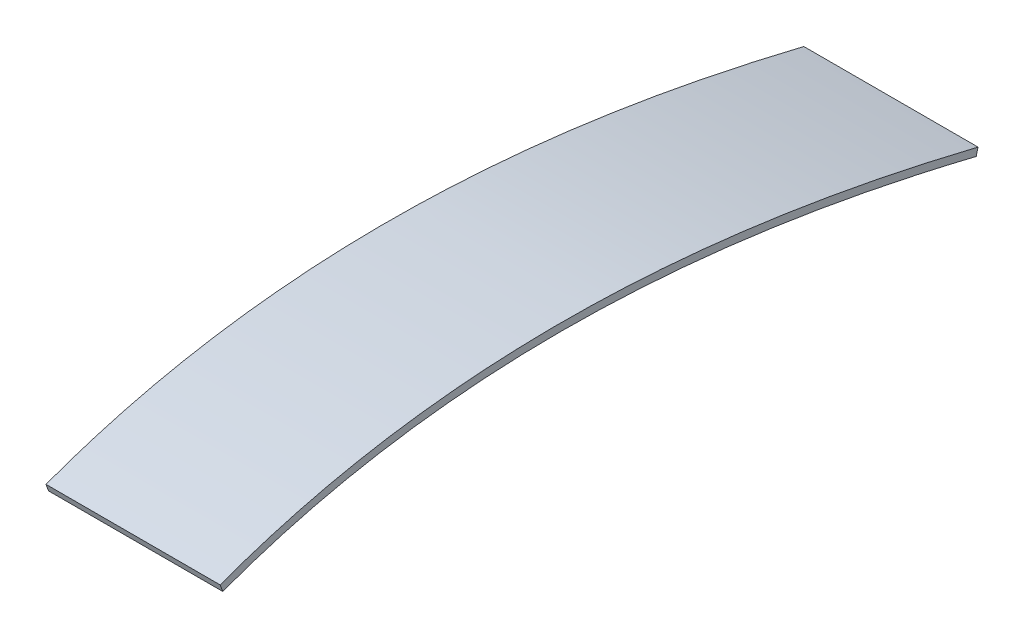
ISO-10303-21;
HEADER;
FILE_DESCRIPTION(('STEP AP214'),'2;1');
FILE_NAME('part.step','',(''),(''),'','','');
FILE_SCHEMA(('AUTOMOTIVE_DESIGN { 1 0 10303 214 1 1 1 1 }'));
ENDSEC;
DATA;
#1=APPLICATION_CONTEXT('core data for automotive mechanical design processes');
#2=APPLICATION_PROTOCOL_DEFINITION('international standard','automotive_design',2000,#1);
#3=PRODUCT_CONTEXT('',#1,'mechanical');
#4=PRODUCT('Part','Part','',(#3));
#5=PRODUCT_RELATED_PRODUCT_CATEGORY('part','',(#4));
#6=PRODUCT_DEFINITION_FORMATION('','',#4);
#7=PRODUCT_DEFINITION_CONTEXT('part definition',#1,'design');
#8=PRODUCT_DEFINITION('design','',#6,#7);
#9=PRODUCT_DEFINITION_SHAPE('','',#8);
#10=(LENGTH_UNIT() NAMED_UNIT(*) SI_UNIT(.MILLI.,.METRE.));
#11=(NAMED_UNIT(*) PLANE_ANGLE_UNIT() SI_UNIT($,.RADIAN.));
#12=(NAMED_UNIT(*) SI_UNIT($,.STERADIAN.) SOLID_ANGLE_UNIT());
#13=UNCERTAINTY_MEASURE_WITH_UNIT(LENGTH_MEASURE(1.E-05),#10,'distance_accuracy_value','');
#14=(GEOMETRIC_REPRESENTATION_CONTEXT(3) GLOBAL_UNCERTAINTY_ASSIGNED_CONTEXT((#13)) GLOBAL_UNIT_ASSIGNED_CONTEXT((#10,
#11,#12)) REPRESENTATION_CONTEXT('',''));
#15=CARTESIAN_POINT('',(0.,0.,0.));
#16=DIRECTION('',(0.,0.,1.));
#17=DIRECTION('',(1.,0.,0.));
#18=AXIS2_PLACEMENT_3D('',#15,#16,#17);
#19=CARTESIAN_POINT('',(-350.,1334.8409703343,2400.34706148792));
#20=CARTESIAN_POINT('',(-350.,1692.38382245875,1437.48815934154));
#21=CARTESIAN_POINT('',(-350.,1573.46660227095,348.254688720797));
#22=CARTESIAN_POINT('',(-350.,1334.8409703343,-628.154342243338));
#23=B_SPLINE_CURVE_WITH_KNOTS('',3,(#19,#20,#21,#22),.UNSPECIFIED.,.F.,.F.,(4,4),(0.,1.),.UNSPECIFIED.);
#24=DIRECTION('',(1.,0.,0.));
#25=VECTOR('',#24,1.);
#26=SURFACE_OF_LINEAR_EXTRUSION('',#23,#25);
#27=DIRECTION('',(1.,0.,0.));
#28=VECTOR('',#27,1.);
#29=CARTESIAN_POINT('',(-350.,1334.8409703343,-628.154342243338));
#30=LINE('',#29,#28);
#31=CARTESIAN_POINT('',(-350.,1334.8409703343,-628.154342243338));
#32=VERTEX_POINT('',#31);
#33=CARTESIAN_POINT('',(350.,1334.8409703343,-628.154342243338));
#34=VERTEX_POINT('',#33);
#35=EDGE_CURVE('E38',#32,#34,#30,.T.);
#36=ORIENTED_EDGE('',*,*,#35,.T.);
#37=CARTESIAN_POINT('',(350.,1334.8409703343,2400.34706148792));
#38=CARTESIAN_POINT('',(350.,1692.38382245875,1437.48815934154));
#39=CARTESIAN_POINT('',(350.,1573.46660227095,348.254688720797));
#40=CARTESIAN_POINT('',(350.,1334.8409703343,-628.154342243338));
#41=B_SPLINE_CURVE_WITH_KNOTS('',3,(#37,#38,#39,#40),.UNSPECIFIED.,.F.,.F.,(4,4),(0.,1.),.UNSPECIFIED.);
#42=CARTESIAN_POINT('',(350.,1334.8409703343,2400.34706148791));
#43=VERTEX_POINT('',#42);
#44=EDGE_CURVE('E75',#43,#34,#41,.T.);
#45=ORIENTED_EDGE('',*,*,#44,.F.);
#46=DIRECTION('',(1.,0.,0.));
#47=VECTOR('',#46,1.);
#48=CARTESIAN_POINT('',(-350.,1334.8409703343,2400.34706148791));
#49=LINE('',#48,#47);
#50=CARTESIAN_POINT('',(-350.,1334.8409703343,2400.34706148791));
#51=VERTEX_POINT('',#50);
#52=EDGE_CURVE('E11',#51,#43,#49,.T.);
#53=ORIENTED_EDGE('',*,*,#52,.F.);
#54=EDGE_CURVE('E76',#51,#32,#23,.T.);
#55=ORIENTED_EDGE('',*,*,#54,.T.);
#56=EDGE_LOOP('',(#36,#45,#53,#55));
#57=FACE_BOUND('',#56,.T.);
#58=ADVANCED_FACE('F34',(#57),#26,.T.);
#59=CARTESIAN_POINT('',(-350.,1334.8409703343,2400.34706148791));
#60=DIRECTION('',(0.,-0.348109137450129,0.937454014031476));
#61=DIRECTION('',(0.,-0.937454014031476,-0.348109137450129));
#62=AXIS2_PLACEMENT_3D('',#59,#60,#61);
#63=PLANE('',#62);
#64=ORIENTED_EDGE('',*,*,#52,.T.);
#65=DIRECTION('',(0.,-0.937454014031476,-0.348109137450129));
#66=VECTOR('',#65,1.);
#67=CARTESIAN_POINT('',(350.,1334.8409703343,2400.34706148791));
#68=LINE('',#67,#66);
#69=CARTESIAN_POINT('',(350.,1362.96459075524,2410.79033561142));
#70=VERTEX_POINT('',#69);
#71=EDGE_CURVE('E92',#70,#43,#68,.T.);
#72=ORIENTED_EDGE('',*,*,#71,.F.);
#73=DIRECTION('',(1.,0.,0.));
#74=VECTOR('',#73,1.);
#75=CARTESIAN_POINT('',(-350.,1362.96459075524,2410.79033561142));
#76=LINE('',#75,#74);
#77=CARTESIAN_POINT('',(-350.,1362.96459075524,2410.79033561142));
#78=VERTEX_POINT('',#77);
#79=EDGE_CURVE('E43',#78,#70,#76,.T.);
#80=ORIENTED_EDGE('',*,*,#79,.F.);
#81=DIRECTION('',(0.,-0.937454014031476,-0.348109137450129));
#82=VECTOR('',#81,1.);
#83=CARTESIAN_POINT('',(-350.,1334.8409703343,2400.34706148791));
#84=LINE('',#83,#82);
#85=EDGE_CURVE('E81',#78,#51,#84,.T.);
#86=ORIENTED_EDGE('',*,*,#85,.T.);
#87=EDGE_LOOP('',(#64,#72,#80,#86));
#88=FACE_BOUND('',#87,.T.);
#89=ADVANCED_FACE('F127',(#88),#63,.T.);
#90=CARTESIAN_POINT('',(-350.,1363.9832993857,-635.276466747993));
#91=CARTESIAN_POINT('',(-350.,1367.72714451011,-619.957390752926));
#92=CARTESIAN_POINT('',(-350.,1375.13998434674,-589.330417146131));
#93=CARTESIAN_POINT('',(-350.,1386.08920253334,-543.172309386164));
#94=CARTESIAN_POINT('',(-350.,1396.84337470251,-496.870720266598));
#95=CARTESIAN_POINT('',(-350.,1410.91722994469,-434.926793801571));
#96=CARTESIAN_POINT('',(-350.,1427.98932548613,-357.13081423557));
#97=CARTESIAN_POINT('',(-350.,1447.57864192653,-263.229822519666));
#98=CARTESIAN_POINT('',(-350.,1466.20479529328,-168.827358300612));
#99=CARTESIAN_POINT('',(-350.,1489.66783601353,-42.3462731588354));
#100=CARTESIAN_POINT('',(-350.,1516.25991762875,116.792406764924));
#101=CARTESIAN_POINT('',(-350.,1543.2647306401,309.071946528238));
#102=CARTESIAN_POINT('',(-350.,1572.02641996029,566.733477317057));
#103=CARTESIAN_POINT('',(-350.,1593.07341731178,890.36077300932));
#104=CARTESIAN_POINT('',(-350.,1590.71157552662,1213.74240653232));
#105=CARTESIAN_POINT('',(-350.,1572.64529888216,1470.90446444029));
#106=CARTESIAN_POINT('',(-350.,1550.4724969053,1662.65244252092));
#107=CARTESIAN_POINT('',(-350.,1519.14140762692,1852.92294275562));
#108=CARTESIAN_POINT('',(-350.,1484.95411189482,2009.95247404332));
#109=CARTESIAN_POINT('',(-350.,1452.48968090926,2134.47884906968));
#110=CARTESIAN_POINT('',(-350.,1425.51800746822,2227.27763033807));
#111=CARTESIAN_POINT('',(-350.,1400.79761065654,2304.08150872316));
#112=CARTESIAN_POINT('',(-350.,1379.64693028178,2365.17035838237));
#113=CARTESIAN_POINT('',(-350.,1368.59897300944,2395.61700721368));
#114=CARTESIAN_POINT('',(-350.,1362.96459075524,2410.79033561142));
#115=B_SPLINE_CURVE_WITH_KNOTS('',3,(#90,#91,#92,#93,#94,#95,#96,#97,#98,#99,#100,#101,#102,
#103,#104,#105,#106,#107,#108,#109,#110,#111,#112,#113,#114),.UNSPECIFIED.,.F.,.F.,(4,1,1,1,1,1,
1,1,1,1,1,1,1,1,1,1,1,1,1,1,1,1,4),(0.,0.015625,0.03125,0.046875,0.0625,0.09375,0.125,0.15625,
0.1875,0.25,0.3125,0.375,0.5,0.625,0.6875,0.75,0.8125,0.875,0.90625,0.9375,0.96875,0.984375,1.),.UNSPECIFIED.);
#116=DIRECTION('',(1.,0.,0.));
#117=VECTOR('',#116,1.);
#118=SURFACE_OF_LINEAR_EXTRUSION('',#115,#117);
#119=ORIENTED_EDGE('',*,*,#79,.T.);
#120=CARTESIAN_POINT('',(350.,1363.9832993857,-635.276466747993));
#121=CARTESIAN_POINT('',(350.,1367.72714451011,-619.957390752926));
#122=CARTESIAN_POINT('',(350.,1375.13998434674,-589.330417146131));
#123=CARTESIAN_POINT('',(350.,1386.08920253334,-543.172309386164));
#124=CARTESIAN_POINT('',(350.,1396.84337470251,-496.870720266598));
#125=CARTESIAN_POINT('',(350.,1410.91722994469,-434.926793801571));
#126=CARTESIAN_POINT('',(350.,1427.98932548613,-357.13081423557));
#127=CARTESIAN_POINT('',(350.,1447.57864192653,-263.229822519666));
#128=CARTESIAN_POINT('',(350.,1466.20479529328,-168.827358300612));
#129=CARTESIAN_POINT('',(350.,1489.66783601353,-42.3462731588354));
#130=CARTESIAN_POINT('',(350.,1516.25991762875,116.792406764924));
#131=CARTESIAN_POINT('',(350.,1543.2647306401,309.071946528238));
#132=CARTESIAN_POINT('',(350.,1572.02641996029,566.733477317057));
#133=CARTESIAN_POINT('',(350.,1593.07341731178,890.36077300932));
#134=CARTESIAN_POINT('',(350.,1590.71157552662,1213.74240653232));
#135=CARTESIAN_POINT('',(350.,1572.64529888216,1470.90446444029));
#136=CARTESIAN_POINT('',(350.,1550.4724969053,1662.65244252092));
#137=CARTESIAN_POINT('',(350.,1519.14140762692,1852.92294275562));
#138=CARTESIAN_POINT('',(350.,1484.95411189482,2009.95247404332));
#139=CARTESIAN_POINT('',(350.,1452.48968090926,2134.47884906968));
#140=CARTESIAN_POINT('',(350.,1425.51800746822,2227.27763033807));
#141=CARTESIAN_POINT('',(350.,1400.79761065654,2304.08150872316));
#142=CARTESIAN_POINT('',(350.,1379.64693028178,2365.17035838237));
#143=CARTESIAN_POINT('',(350.,1368.59897300944,2395.61700721368));
#144=CARTESIAN_POINT('',(350.,1362.96459075524,2410.79033561142));
#145=B_SPLINE_CURVE_WITH_KNOTS('',3,(#120,#121,#122,#123,#124,#125,#126,#127,#128,#129,#130,
#131,#132,#133,#134,#135,#136,#137,#138,#139,#140,#141,#142,#143,#144),.UNSPECIFIED.,.F.,.F.,(4,
1,1,1,1,1,1,1,1,1,1,1,1,1,1,1,1,1,1,1,1,1,4),(0.,0.015625,0.03125,0.046875,0.0625,0.09375,0.125,
0.15625,0.1875,0.25,0.3125,0.375,0.5,0.625,0.6875,0.75,0.8125,0.875,0.90625,0.9375,0.96875,
0.984375,1.),.UNSPECIFIED.);
#146=CARTESIAN_POINT('',(350.,1363.9832993857,-635.276466747993));
#147=VERTEX_POINT('',#146);
#148=EDGE_CURVE('E88',#147,#70,#145,.T.);
#149=ORIENTED_EDGE('',*,*,#148,.F.);
#150=DIRECTION('',(1.,0.,0.));
#151=VECTOR('',#150,1.);
#152=CARTESIAN_POINT('',(-350.,1363.9832993857,-635.276466747993));
#153=LINE('',#152,#151);
#154=CARTESIAN_POINT('',(-350.,1363.9832993857,-635.276466747993));
#155=VERTEX_POINT('',#154);
#156=EDGE_CURVE('E80',#155,#147,#153,.T.);
#157=ORIENTED_EDGE('',*,*,#156,.F.);
#158=EDGE_CURVE('E115',#155,#78,#115,.T.);
#159=ORIENTED_EDGE('',*,*,#158,.T.);
#160=EDGE_LOOP('',(#119,#149,#157,#159));
#161=FACE_BOUND('',#160,.T.);
#162=ADVANCED_FACE('F124',(#161),#118,.T.);
#163=CARTESIAN_POINT('',(-350.,1334.8409703343,-628.154342243338));
#164=DIRECTION('',(0.,-0.237404150155189,-0.971410968380063));
#165=DIRECTION('',(0.,0.971410968380063,-0.237404150155189));
#166=AXIS2_PLACEMENT_3D('',#163,#164,#165);
#167=PLANE('',#166);
#168=ORIENTED_EDGE('',*,*,#156,.T.);
#169=DIRECTION('',(0.,0.971410968380064,-0.237404150155189));
#170=VECTOR('',#169,1.);
#171=CARTESIAN_POINT('',(350.,1334.8409703343,-628.154342243338));
#172=LINE('',#171,#170);
#173=EDGE_CURVE('E83',#34,#147,#172,.T.);
#174=ORIENTED_EDGE('',*,*,#173,.F.);
#175=ORIENTED_EDGE('',*,*,#35,.F.);
#176=DIRECTION('',(0.,0.971410968380064,-0.237404150155189));
#177=VECTOR('',#176,1.);
#178=CARTESIAN_POINT('',(-350.,1334.8409703343,-628.154342243338));
#179=LINE('',#178,#177);
#180=EDGE_CURVE('E110',#32,#155,#179,.T.);
#181=ORIENTED_EDGE('',*,*,#180,.T.);
#182=EDGE_LOOP('',(#168,#174,#175,#181));
#183=FACE_BOUND('',#182,.T.);
#184=ADVANCED_FACE('F84',(#183),#167,.T.);
#185=CARTESIAN_POINT('',(-350.,1558.40415185721,891.177657928948));
#186=DIRECTION('',(-1.,0.,0.));
#187=DIRECTION('',(0.,0.,1.));
#188=AXIS2_PLACEMENT_3D('',#185,#186,#187);
#189=PLANE('',#188);
#190=ORIENTED_EDGE('',*,*,#54,.F.);
#191=ORIENTED_EDGE('',*,*,#85,.F.);
#192=ORIENTED_EDGE('',*,*,#158,.F.);
#193=ORIENTED_EDGE('',*,*,#180,.F.);
#194=EDGE_LOOP('',(#190,#191,#192,#193));
#195=FACE_BOUND('',#194,.T.);
#196=ADVANCED_FACE('F131',(#195),#189,.T.);
#197=CARTESIAN_POINT('',(350.,1558.40415185721,891.177657928948));
#198=DIRECTION('',(-1.,0.,0.));
#199=DIRECTION('',(0.,0.,1.));
#200=AXIS2_PLACEMENT_3D('',#197,#198,#199);
#201=PLANE('',#200);
#202=ORIENTED_EDGE('',*,*,#44,.T.);
#203=ORIENTED_EDGE('',*,*,#173,.T.);
#204=ORIENTED_EDGE('',*,*,#148,.T.);
#205=ORIENTED_EDGE('',*,*,#71,.T.);
#206=EDGE_LOOP('',(#202,#203,#204,#205));
#207=FACE_BOUND('',#206,.T.);
#208=ADVANCED_FACE('F91',(#207),#201,.F.);
#209=CLOSED_SHELL('',(#58,#89,#162,#184,#196,#208));
#210=MANIFOLD_SOLID_BREP('B2',#209);
#211=ADVANCED_BREP_SHAPE_REPRESENTATION('',(#18,#210),#14);
#212=SHAPE_DEFINITION_REPRESENTATION(#9,#211);
ENDSEC;
END-ISO-10303-21;
